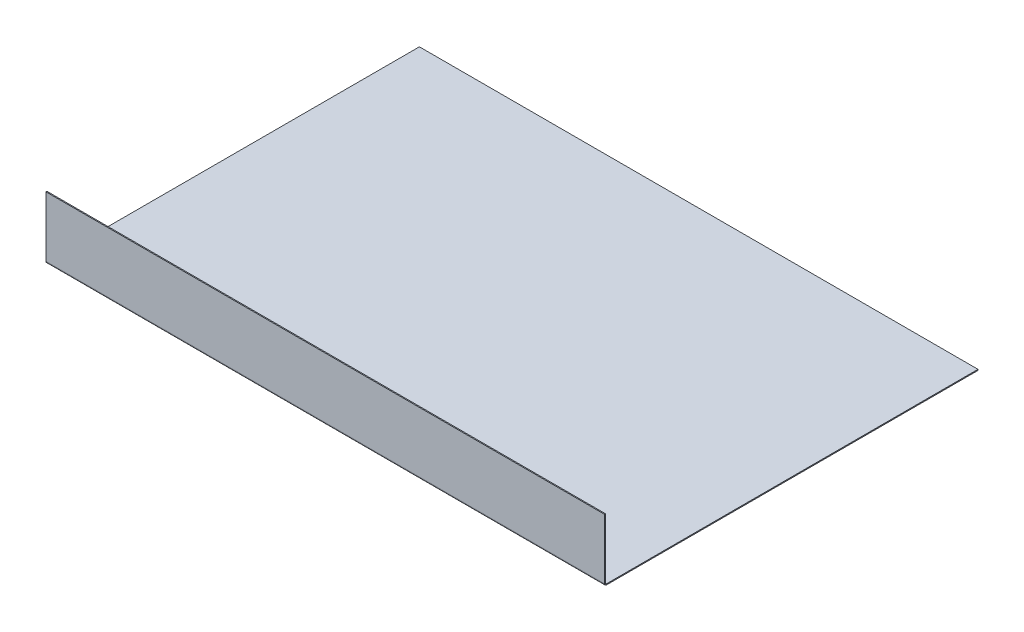
ISO-10303-21;
HEADER;
FILE_DESCRIPTION(('STEP AP214'),'2;1');
FILE_NAME('part.step','',(''),(''),'','','');
FILE_SCHEMA(('AUTOMOTIVE_DESIGN { 1 0 10303 214 1 1 1 1 }'));
ENDSEC;
DATA;
#1=APPLICATION_CONTEXT('core data for automotive mechanical design processes');
#2=APPLICATION_PROTOCOL_DEFINITION('international standard','automotive_design',2000,#1);
#3=PRODUCT_CONTEXT('',#1,'mechanical');
#4=PRODUCT('Part','Part','',(#3));
#5=PRODUCT_RELATED_PRODUCT_CATEGORY('part','',(#4));
#6=PRODUCT_DEFINITION_FORMATION('','',#4);
#7=PRODUCT_DEFINITION_CONTEXT('part definition',#1,'design');
#8=PRODUCT_DEFINITION('design','',#6,#7);
#9=PRODUCT_DEFINITION_SHAPE('','',#8);
#10=(LENGTH_UNIT() NAMED_UNIT(*) SI_UNIT(.MILLI.,.METRE.));
#11=(NAMED_UNIT(*) PLANE_ANGLE_UNIT() SI_UNIT($,.RADIAN.));
#12=(NAMED_UNIT(*) SI_UNIT($,.STERADIAN.) SOLID_ANGLE_UNIT());
#13=UNCERTAINTY_MEASURE_WITH_UNIT(LENGTH_MEASURE(1.E-05),#10,'distance_accuracy_value','');
#14=(GEOMETRIC_REPRESENTATION_CONTEXT(3) GLOBAL_UNCERTAINTY_ASSIGNED_CONTEXT((#13)) GLOBAL_UNIT_ASSIGNED_CONTEXT((#10,
#11,#12)) REPRESENTATION_CONTEXT('',''));
#15=CARTESIAN_POINT('',(0.,0.,0.));
#16=DIRECTION('',(0.,0.,1.));
#17=DIRECTION('',(1.,0.,0.));
#18=AXIS2_PLACEMENT_3D('',#15,#16,#17);
#19=CARTESIAN_POINT('',(228.6,-0.8128,0.));
#20=DIRECTION('',(1.,0.,0.));
#21=DIRECTION('',(0.,0.,-1.));
#22=AXIS2_PLACEMENT_3D('',#19,#20,#21);
#23=PLANE('',#22);
#24=DIRECTION('',(0.,0.,-1.));
#25=VECTOR('',#24,1.);
#26=CARTESIAN_POINT('',(228.6,0.,0.));
#27=LINE('',#26,#25);
#28=CARTESIAN_POINT('',(228.6,0.,304.0634));
#29=VERTEX_POINT('',#28);
#30=CARTESIAN_POINT('',(228.6,0.,0.));
#31=VERTEX_POINT('',#30);
#32=EDGE_CURVE('E80',#29,#31,#27,.T.);
#33=ORIENTED_EDGE('',*,*,#32,.F.);
#34=DIRECTION('',(0.,-1.,0.));
#35=VECTOR('',#34,1.);
#36=CARTESIAN_POINT('',(228.6,0.,304.0634));
#37=LINE('',#36,#35);
#38=CARTESIAN_POINT('',(228.6,-0.8128,304.0634));
#39=VERTEX_POINT('',#38);
#40=EDGE_CURVE('E92',#29,#39,#37,.T.);
#41=ORIENTED_EDGE('',*,*,#40,.T.);
#42=DIRECTION('',(0.,0.,-1.));
#43=VECTOR('',#42,1.);
#44=CARTESIAN_POINT('',(228.6,-0.8128,0.));
#45=LINE('',#44,#43);
#46=CARTESIAN_POINT('',(228.6,-0.8128,0.));
#47=VERTEX_POINT('',#46);
#48=EDGE_CURVE('E86',#39,#47,#45,.T.);
#49=ORIENTED_EDGE('',*,*,#48,.T.);
#50=DIRECTION('',(0.,1.,0.));
#51=VECTOR('',#50,1.);
#52=CARTESIAN_POINT('',(228.6,-0.8128,0.));
#53=LINE('',#52,#51);
#54=EDGE_CURVE('E39',#47,#31,#53,.T.);
#55=ORIENTED_EDGE('',*,*,#54,.T.);
#56=EDGE_LOOP('',(#33,#41,#49,#55));
#57=FACE_BOUND('',#56,.T.);
#58=ADVANCED_FACE('F35',(#57),#23,.T.);
#59=CARTESIAN_POINT('',(0.,-0.8128,0.));
#60=DIRECTION('',(0.,1.,0.));
#61=DIRECTION('',(0.,0.,1.));
#62=AXIS2_PLACEMENT_3D('',#59,#60,#61);
#63=PLANE('',#62);
#64=DIRECTION('',(1.,0.,0.));
#65=VECTOR('',#64,1.);
#66=CARTESIAN_POINT('',(228.6,-0.8128,304.0634));
#67=LINE('',#66,#65);
#68=CARTESIAN_POINT('',(-228.6,-0.8128,304.0634));
#69=VERTEX_POINT('',#68);
#70=EDGE_CURVE('E108',#39,#69,#67,.F.);
#71=ORIENTED_EDGE('',*,*,#70,.T.);
#72=DIRECTION('',(0.,0.,1.));
#73=VECTOR('',#72,1.);
#74=CARTESIAN_POINT('',(-228.6,-0.8128,0.));
#75=LINE('',#74,#73);
#76=CARTESIAN_POINT('',(-228.6,-0.8128,0.));
#77=VERTEX_POINT('',#76);
#78=EDGE_CURVE('E84',#77,#69,#75,.T.);
#79=ORIENTED_EDGE('',*,*,#78,.F.);
#80=DIRECTION('',(-1.,0.,0.));
#81=VECTOR('',#80,1.);
#82=CARTESIAN_POINT('',(-228.6,-0.8128,0.));
#83=LINE('',#82,#81);
#84=EDGE_CURVE('E74',#47,#77,#83,.T.);
#85=ORIENTED_EDGE('',*,*,#84,.F.);
#86=ORIENTED_EDGE('',*,*,#48,.F.);
#87=EDGE_LOOP('',(#71,#79,#85,#86));
#88=FACE_BOUND('',#87,.T.);
#89=ADVANCED_FACE('F199',(#88),#63,.F.);
#90=CARTESIAN_POINT('',(0.,0.,0.));
#91=DIRECTION('',(0.,1.,0.));
#92=DIRECTION('',(0.,0.,1.));
#93=AXIS2_PLACEMENT_3D('',#90,#91,#92);
#94=PLANE('',#93);
#95=DIRECTION('',(0.,0.,1.));
#96=VECTOR('',#95,1.);
#97=CARTESIAN_POINT('',(-228.6,0.,0.));
#98=LINE('',#97,#96);
#99=CARTESIAN_POINT('',(-228.6,0.,0.));
#100=VERTEX_POINT('',#99);
#101=CARTESIAN_POINT('',(-228.6,0.,304.0634));
#102=VERTEX_POINT('',#101);
#103=EDGE_CURVE('E76',#100,#102,#98,.T.);
#104=ORIENTED_EDGE('',*,*,#103,.T.);
#105=DIRECTION('',(1.,0.,0.));
#106=VECTOR('',#105,1.);
#107=CARTESIAN_POINT('',(228.6,0.,304.0634));
#108=LINE('',#107,#106);
#109=EDGE_CURVE('E50',#29,#102,#108,.F.);
#110=ORIENTED_EDGE('',*,*,#109,.F.);
#111=ORIENTED_EDGE('',*,*,#32,.T.);
#112=DIRECTION('',(-1.,0.,0.));
#113=VECTOR('',#112,1.);
#114=CARTESIAN_POINT('',(-228.6,0.,0.));
#115=LINE('',#114,#113);
#116=EDGE_CURVE('E72',#31,#100,#115,.T.);
#117=ORIENTED_EDGE('',*,*,#116,.T.);
#118=EDGE_LOOP('',(#104,#110,#111,#117));
#119=FACE_BOUND('',#118,.T.);
#120=ADVANCED_FACE('F82',(#119),#94,.T.);
#121=CARTESIAN_POINT('',(-228.6,-0.8128,0.));
#122=DIRECTION('',(-1.,0.,0.));
#123=DIRECTION('',(0.,0.,1.));
#124=AXIS2_PLACEMENT_3D('',#121,#122,#123);
#125=PLANE('',#124);
#126=DIRECTION('',(0.,-1.,0.));
#127=VECTOR('',#126,1.);
#128=CARTESIAN_POINT('',(-228.6,0.,304.0634));
#129=LINE('',#128,#127);
#130=EDGE_CURVE('E79',#102,#69,#129,.T.);
#131=ORIENTED_EDGE('',*,*,#130,.F.);
#132=ORIENTED_EDGE('',*,*,#103,.F.);
#133=DIRECTION('',(0.,1.,0.));
#134=VECTOR('',#133,1.);
#135=CARTESIAN_POINT('',(-228.6,-0.8128,0.));
#136=LINE('',#135,#134);
#137=EDGE_CURVE('E11',#77,#100,#136,.T.);
#138=ORIENTED_EDGE('',*,*,#137,.F.);
#139=ORIENTED_EDGE('',*,*,#78,.T.);
#140=EDGE_LOOP('',(#131,#132,#138,#139));
#141=FACE_BOUND('',#140,.T.);
#142=ADVANCED_FACE('F37',(#141),#125,.T.);
#143=CARTESIAN_POINT('',(-228.6,-0.8128,0.));
#144=DIRECTION('',(0.,0.,-1.));
#145=DIRECTION('',(-1.,0.,0.));
#146=AXIS2_PLACEMENT_3D('',#143,#144,#145);
#147=PLANE('',#146);
#148=ORIENTED_EDGE('',*,*,#116,.F.);
#149=ORIENTED_EDGE('',*,*,#54,.F.);
#150=ORIENTED_EDGE('',*,*,#84,.T.);
#151=ORIENTED_EDGE('',*,*,#137,.T.);
#152=EDGE_LOOP('',(#148,#149,#150,#151));
#153=FACE_BOUND('',#152,.T.);
#154=ADVANCED_FACE('F69',(#153),#147,.T.);
#155=CARTESIAN_POINT('',(-228.6,0.736599999999976,304.0634));
#156=DIRECTION('',(-1.,0.,0.));
#157=DIRECTION('',(0.,0.,1.));
#158=AXIS2_PLACEMENT_3D('',#155,#156,#157);
#159=PLANE('',#158);
#160=DIRECTION('',(0.,0.,1.));
#161=VECTOR('',#160,1.);
#162=CARTESIAN_POINT('',(-228.6,0.736599999999976,304.8));
#163=LINE('',#162,#161);
#164=CARTESIAN_POINT('',(-228.6,0.736599999999976,304.8));
#165=VERTEX_POINT('',#164);
#166=CARTESIAN_POINT('',(-228.6,0.736599999999976,305.6128));
#167=VERTEX_POINT('',#166);
#168=EDGE_CURVE('E140',#165,#167,#163,.T.);
#169=ORIENTED_EDGE('',*,*,#168,.F.);
#170=CARTESIAN_POINT('',(-228.6,0.736599999999976,304.0634));
#171=DIRECTION('',(1.,0.,0.));
#172=DIRECTION('',(0.,0.,-1.));
#173=AXIS2_PLACEMENT_3D('',#170,#171,#172);
#174=CIRCLE('',#173,0.736599999999976);
#175=EDGE_CURVE('E102',#102,#165,#174,.F.);
#176=ORIENTED_EDGE('',*,*,#175,.F.);
#177=ORIENTED_EDGE('',*,*,#130,.T.);
#178=CARTESIAN_POINT('',(-228.6,0.736599999999976,304.0634));
#179=DIRECTION('',(1.,0.,0.));
#180=DIRECTION('',(0.,0.,-1.));
#181=AXIS2_PLACEMENT_3D('',#178,#179,#180);
#182=CIRCLE('',#181,1.54939999999998);
#183=EDGE_CURVE('E95',#69,#167,#182,.F.);
#184=ORIENTED_EDGE('',*,*,#183,.T.);
#185=EDGE_LOOP('',(#169,#176,#177,#184));
#186=FACE_BOUND('',#185,.T.);
#187=ADVANCED_FACE('F201',(#186),#159,.T.);
#188=CARTESIAN_POINT('',(228.6,0.736599999999976,304.0634));
#189=DIRECTION('',(-1.,0.,0.));
#190=DIRECTION('',(0.,0.,1.));
#191=AXIS2_PLACEMENT_3D('',#188,#189,#190);
#192=PLANE('',#191);
#193=CARTESIAN_POINT('',(228.6,0.736599999999976,304.0634));
#194=DIRECTION('',(1.,0.,0.));
#195=DIRECTION('',(0.,0.,-1.));
#196=AXIS2_PLACEMENT_3D('',#193,#194,#195);
#197=CIRCLE('',#196,0.736599999999976);
#198=CARTESIAN_POINT('',(228.6,0.736599999999976,304.8));
#199=VERTEX_POINT('',#198);
#200=EDGE_CURVE('E97',#199,#29,#197,.T.);
#201=ORIENTED_EDGE('',*,*,#200,.F.);
#202=DIRECTION('',(0.,0.,1.));
#203=VECTOR('',#202,1.);
#204=CARTESIAN_POINT('',(228.6,0.736599999999976,304.8));
#205=LINE('',#204,#203);
#206=CARTESIAN_POINT('',(228.6,0.736599999999976,305.6128));
#207=VERTEX_POINT('',#206);
#208=EDGE_CURVE('E139',#199,#207,#205,.T.);
#209=ORIENTED_EDGE('',*,*,#208,.T.);
#210=CARTESIAN_POINT('',(228.6,0.736599999999976,304.0634));
#211=DIRECTION('',(1.,0.,0.));
#212=DIRECTION('',(0.,0.,-1.));
#213=AXIS2_PLACEMENT_3D('',#210,#211,#212);
#214=CIRCLE('',#213,1.54939999999998);
#215=EDGE_CURVE('E105',#207,#39,#214,.T.);
#216=ORIENTED_EDGE('',*,*,#215,.T.);
#217=ORIENTED_EDGE('',*,*,#40,.F.);
#218=EDGE_LOOP('',(#201,#209,#216,#217));
#219=FACE_BOUND('',#218,.T.);
#220=ADVANCED_FACE('F162',(#219),#192,.F.);
#221=CARTESIAN_POINT('',(228.6,0.736599999999976,304.0634));
#222=DIRECTION('',(1.,0.,0.));
#223=DIRECTION('',(0.,0.,1.));
#224=AXIS2_PLACEMENT_3D('',#221,#222,#223);
#225=CYLINDRICAL_SURFACE('',#224,1.54939999999998);
#226=ORIENTED_EDGE('',*,*,#70,.F.);
#227=ORIENTED_EDGE('',*,*,#215,.F.);
#228=DIRECTION('',(-1.,0.,0.));
#229=VECTOR('',#228,1.);
#230=CARTESIAN_POINT('',(0.,0.736599999999976,305.6128));
#231=LINE('',#230,#229);
#232=EDGE_CURVE('E129',#207,#167,#231,.T.);
#233=ORIENTED_EDGE('',*,*,#232,.T.);
#234=ORIENTED_EDGE('',*,*,#183,.F.);
#235=EDGE_LOOP('',(#226,#227,#233,#234));
#236=FACE_BOUND('',#235,.T.);
#237=ADVANCED_FACE('F202',(#236),#225,.T.);
#238=CARTESIAN_POINT('',(228.6,0.736599999999976,304.0634));
#239=DIRECTION('',(1.,0.,0.));
#240=DIRECTION('',(0.,0.,1.));
#241=AXIS2_PLACEMENT_3D('',#238,#239,#240);
#242=CYLINDRICAL_SURFACE('',#241,0.736599999999976);
#243=ORIENTED_EDGE('',*,*,#109,.T.);
#244=ORIENTED_EDGE('',*,*,#175,.T.);
#245=DIRECTION('',(1.,0.,0.));
#246=VECTOR('',#245,1.);
#247=CARTESIAN_POINT('',(-228.6,0.736599999999976,304.8));
#248=LINE('',#247,#246);
#249=EDGE_CURVE('E143',#165,#199,#248,.T.);
#250=ORIENTED_EDGE('',*,*,#249,.T.);
#251=ORIENTED_EDGE('',*,*,#200,.T.);
#252=EDGE_LOOP('',(#243,#244,#250,#251));
#253=FACE_BOUND('',#252,.T.);
#254=ADVANCED_FACE('F151',(#253),#242,.F.);
#255=CARTESIAN_POINT('',(-228.6,0.,305.6128));
#256=DIRECTION('',(1.,0.,0.));
#257=DIRECTION('',(0.,0.,-1.));
#258=AXIS2_PLACEMENT_3D('',#255,#256,#257);
#259=PLANE('',#258);
#260=ORIENTED_EDGE('',*,*,#168,.T.);
#261=DIRECTION('',(0.,-1.,0.));
#262=VECTOR('',#261,1.);
#263=CARTESIAN_POINT('',(-228.6,0.,305.6128));
#264=LINE('',#263,#262);
#265=CARTESIAN_POINT('',(-228.6,49.9872,305.6128));
#266=VERTEX_POINT('',#265);
#267=EDGE_CURVE('E122',#266,#167,#264,.T.);
#268=ORIENTED_EDGE('',*,*,#267,.F.);
#269=DIRECTION('',(0.,0.,-1.));
#270=VECTOR('',#269,1.);
#271=CARTESIAN_POINT('',(-228.6,49.9872,305.6128));
#272=LINE('',#271,#270);
#273=CARTESIAN_POINT('',(-228.6,49.9872,304.8));
#274=VERTEX_POINT('',#273);
#275=EDGE_CURVE('E115',#266,#274,#272,.T.);
#276=ORIENTED_EDGE('',*,*,#275,.T.);
#277=DIRECTION('',(0.,-1.,0.));
#278=VECTOR('',#277,1.);
#279=CARTESIAN_POINT('',(-228.6,0.,304.8));
#280=LINE('',#279,#278);
#281=EDGE_CURVE('E126',#274,#165,#280,.T.);
#282=ORIENTED_EDGE('',*,*,#281,.T.);
#283=EDGE_LOOP('',(#260,#268,#276,#282));
#284=FACE_BOUND('',#283,.T.);
#285=ADVANCED_FACE('F183',(#284),#259,.F.);
#286=CARTESIAN_POINT('',(228.6,49.9872,305.6128));
#287=DIRECTION('',(-1.,0.,0.));
#288=DIRECTION('',(0.,0.,1.));
#289=AXIS2_PLACEMENT_3D('',#286,#287,#288);
#290=PLANE('',#289);
#291=ORIENTED_EDGE('',*,*,#208,.F.);
#292=DIRECTION('',(0.,1.,0.));
#293=VECTOR('',#292,1.);
#294=CARTESIAN_POINT('',(228.6,49.9872,304.8));
#295=LINE('',#294,#293);
#296=CARTESIAN_POINT('',(228.6,49.9872,304.8));
#297=VERTEX_POINT('',#296);
#298=EDGE_CURVE('E123',#199,#297,#295,.T.);
#299=ORIENTED_EDGE('',*,*,#298,.T.);
#300=DIRECTION('',(0.,0.,-1.));
#301=VECTOR('',#300,1.);
#302=CARTESIAN_POINT('',(228.6,49.9872,305.6128));
#303=LINE('',#302,#301);
#304=CARTESIAN_POINT('',(228.6,49.9872,305.6128));
#305=VERTEX_POINT('',#304);
#306=EDGE_CURVE('E100',#305,#297,#303,.T.);
#307=ORIENTED_EDGE('',*,*,#306,.F.);
#308=DIRECTION('',(0.,1.,0.));
#309=VECTOR('',#308,1.);
#310=CARTESIAN_POINT('',(228.6,49.9872,305.6128));
#311=LINE('',#310,#309);
#312=EDGE_CURVE('E132',#207,#305,#311,.T.);
#313=ORIENTED_EDGE('',*,*,#312,.F.);
#314=EDGE_LOOP('',(#291,#299,#307,#313));
#315=FACE_BOUND('',#314,.T.);
#316=ADVANCED_FACE('F167',(#315),#290,.F.);
#317=CARTESIAN_POINT('',(0.,0.,305.6128));
#318=DIRECTION('',(0.,0.,-1.));
#319=DIRECTION('',(-1.,0.,0.));
#320=AXIS2_PLACEMENT_3D('',#317,#318,#319);
#321=PLANE('',#320);
#322=ORIENTED_EDGE('',*,*,#232,.F.);
#323=ORIENTED_EDGE('',*,*,#312,.T.);
#324=DIRECTION('',(-1.,0.,0.));
#325=VECTOR('',#324,1.);
#326=CARTESIAN_POINT('',(-228.6,49.9872,305.6128));
#327=LINE('',#326,#325);
#328=EDGE_CURVE('E118',#305,#266,#327,.T.);
#329=ORIENTED_EDGE('',*,*,#328,.T.);
#330=ORIENTED_EDGE('',*,*,#267,.T.);
#331=EDGE_LOOP('',(#322,#323,#329,#330));
#332=FACE_BOUND('',#331,.T.);
#333=ADVANCED_FACE('F187',(#332),#321,.F.);
#334=CARTESIAN_POINT('',(0.,0.,304.8));
#335=DIRECTION('',(0.,0.,-1.));
#336=DIRECTION('',(-1.,0.,0.));
#337=AXIS2_PLACEMENT_3D('',#334,#335,#336);
#338=PLANE('',#337);
#339=ORIENTED_EDGE('',*,*,#298,.F.);
#340=ORIENTED_EDGE('',*,*,#249,.F.);
#341=ORIENTED_EDGE('',*,*,#281,.F.);
#342=DIRECTION('',(-1.,0.,0.));
#343=VECTOR('',#342,1.);
#344=CARTESIAN_POINT('',(-228.6,49.9872,304.8));
#345=LINE('',#344,#343);
#346=EDGE_CURVE('E119',#297,#274,#345,.T.);
#347=ORIENTED_EDGE('',*,*,#346,.F.);
#348=EDGE_LOOP('',(#339,#340,#341,#347));
#349=FACE_BOUND('',#348,.T.);
#350=ADVANCED_FACE('F171',(#349),#338,.T.);
#351=CARTESIAN_POINT('',(-228.6,49.9872,305.6128));
#352=DIRECTION('',(0.,-1.,0.));
#353=DIRECTION('',(0.,0.,-1.));
#354=AXIS2_PLACEMENT_3D('',#351,#352,#353);
#355=PLANE('',#354);
#356=ORIENTED_EDGE('',*,*,#346,.T.);
#357=ORIENTED_EDGE('',*,*,#275,.F.);
#358=ORIENTED_EDGE('',*,*,#328,.F.);
#359=ORIENTED_EDGE('',*,*,#306,.T.);
#360=EDGE_LOOP('',(#356,#357,#358,#359));
#361=FACE_BOUND('',#360,.T.);
#362=ADVANCED_FACE('F176',(#361),#355,.F.);
#363=CLOSED_SHELL('',(#58,#89,#120,#142,#154,#187,#220,#237,#254,#285,#316,#333,#350,#362));
#364=MANIFOLD_SOLID_BREP('B2',#363);
#365=ADVANCED_BREP_SHAPE_REPRESENTATION('',(#18,#364),#14);
#366=SHAPE_DEFINITION_REPRESENTATION(#9,#365);
ENDSEC;
END-ISO-10303-21;
